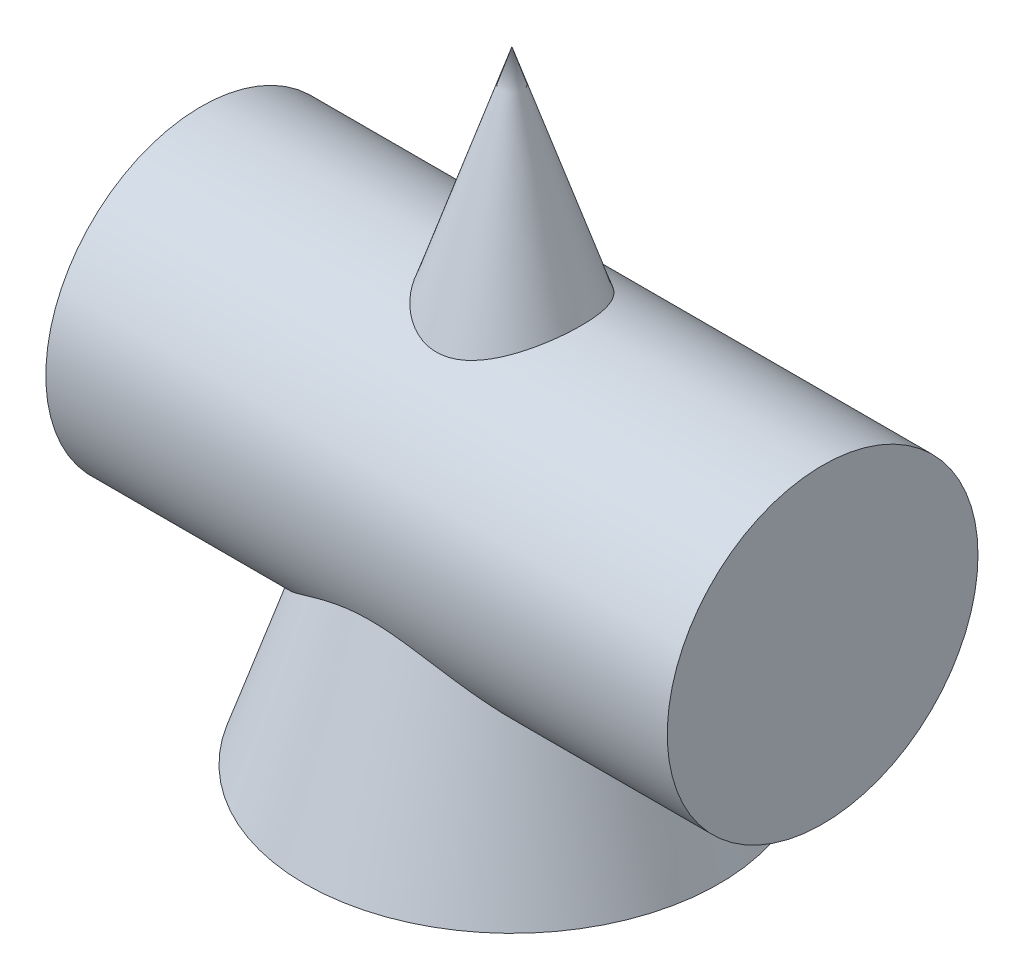
ISO-10303-21;
HEADER;
FILE_DESCRIPTION(('STEP AP214'),'2;1');
FILE_NAME('part.step','',(''),(''),'','','');
FILE_SCHEMA(('AUTOMOTIVE_DESIGN { 1 0 10303 214 1 1 1 1 }'));
ENDSEC;
DATA;
#1=APPLICATION_CONTEXT('core data for automotive mechanical design processes');
#2=APPLICATION_PROTOCOL_DEFINITION('international standard','automotive_design',2000,#1);
#3=PRODUCT_CONTEXT('',#1,'mechanical');
#4=PRODUCT('Part','Part','',(#3));
#5=PRODUCT_RELATED_PRODUCT_CATEGORY('part','',(#4));
#6=PRODUCT_DEFINITION_FORMATION('','',#4);
#7=PRODUCT_DEFINITION_CONTEXT('part definition',#1,'design');
#8=PRODUCT_DEFINITION('design','',#6,#7);
#9=PRODUCT_DEFINITION_SHAPE('','',#8);
#10=(LENGTH_UNIT() NAMED_UNIT(*) SI_UNIT(.MILLI.,.METRE.));
#11=(NAMED_UNIT(*) PLANE_ANGLE_UNIT() SI_UNIT($,.RADIAN.));
#12=(NAMED_UNIT(*) SI_UNIT($,.STERADIAN.) SOLID_ANGLE_UNIT());
#13=UNCERTAINTY_MEASURE_WITH_UNIT(LENGTH_MEASURE(1.E-05),#10,'distance_accuracy_value','');
#14=(GEOMETRIC_REPRESENTATION_CONTEXT(3) GLOBAL_UNCERTAINTY_ASSIGNED_CONTEXT((#13)) GLOBAL_UNIT_ASSIGNED_CONTEXT((#10,
#11,#12)) REPRESENTATION_CONTEXT('',''));
#15=CARTESIAN_POINT('',(0.,0.,0.));
#16=DIRECTION('',(0.,0.,1.));
#17=DIRECTION('',(1.,0.,0.));
#18=AXIS2_PLACEMENT_3D('',#15,#16,#17);
#19=CARTESIAN_POINT('',(0.,60.,0.));
#20=DIRECTION('',(0.,-1.,0.));
#21=DIRECTION('',(0.,0.,-1.));
#22=AXIS2_PLACEMENT_3D('',#19,#20,#21);
#23=CONICAL_SURFACE('',#22,0.,0.321750554396642);
#24=CARTESIAN_POINT('',(-12.6582579578055,13.1227978788821,-9.16144474273097));
#25=CARTESIAN_POINT('',(-12.906057989747,12.9392103508945,-8.92343623878181));
#26=CARTESIAN_POINT('',(-13.146427450124,12.7590327755955,-8.67505850013339));
#27=CARTESIAN_POINT('',(-13.6105617313405,12.4079211393712,-8.15704838342118));
#28=CARTESIAN_POINT('',(-13.8343263055411,12.2369872157556,-7.8874156897717));
#29=CARTESIAN_POINT('',(-14.2628249225345,11.9071926548073,-7.32693824073121));
#30=CARTESIAN_POINT('',(-14.4675770302104,11.7483205835194,-7.03611409950916));
#31=CARTESIAN_POINT('',(-14.8556332820439,11.4453841933494,-6.43320423704956));
#32=CARTESIAN_POINT('',(-15.0389432029007,11.3013158874899,-6.12112427831768));
#33=CARTESIAN_POINT('',(-15.3423748539452,11.0616862660614,-5.54946248089308));
#34=CARTESIAN_POINT('',(-15.4674073899374,10.9625267041328,-5.29398726370502));
#35=CARTESIAN_POINT('',(-15.701326674199,10.7764326866408,-4.7714776387355));
#36=CARTESIAN_POINT('',(-15.810217251202,10.6894953323285,-4.50444599151569));
#37=CARTESIAN_POINT('',(-16.0102844534952,10.5293658391605,-3.9599528509088));
#38=CARTESIAN_POINT('',(-16.1014695234882,10.4561671481605,-3.6824964054046));
#39=CARTESIAN_POINT('',(-16.2646978318328,10.324888770802,-3.11848196459449));
#40=CARTESIAN_POINT('',(-16.3367408573472,10.266809252551,-2.83192386812856));
#41=CARTESIAN_POINT('',(-16.4607976155978,10.1666667559896,-2.24947981645985));
#42=CARTESIAN_POINT('',(-16.5126615671709,10.124723576006,-1.95354110495455));
#43=CARTESIAN_POINT('',(-16.5945347579964,10.0584622807002,-1.35668461914164));
#44=CARTESIAN_POINT('',(-16.6245439719978,10.0341441857424,-1.05576683908154));
#45=CARTESIAN_POINT('',(-16.6620387469385,10.0037545456146,-0.451710402296231));
#46=CARTESIAN_POINT('',(-16.6695319923177,9.99767677523365,-0.148572538674889));
#47=CARTESIAN_POINT('',(-16.6618432204354,10.0039108775291,0.457209296700029));
#48=CARTESIAN_POINT('',(-16.6466631102281,10.0162212035843,0.759853307848173));
#49=CARTESIAN_POINT('',(-16.5969170451751,10.0565252294811,1.32835409018003));
#50=CARTESIAN_POINT('',(-16.5646963959106,10.082621185243,1.59455673866386));
#51=CARTESIAN_POINT('',(-16.4831886420775,10.1485545891208,2.12257982393228));
#52=CARTESIAN_POINT('',(-16.4339030778149,10.1883907970189,2.38440065399142));
#53=CARTESIAN_POINT('',(-16.3190505794183,10.2810688846683,2.90210939745635));
#54=CARTESIAN_POINT('',(-16.2534819079292,10.3339121522255,3.15799667458371));
#55=CARTESIAN_POINT('',(-16.1070307506626,10.4516915173876,3.66249062864728));
#56=CARTESIAN_POINT('',(-16.0261473208349,10.5166283604747,3.91109685566506));
#57=CARTESIAN_POINT('',(-15.8459549259472,10.6609232752184,4.41155982453926));
#58=CARTESIAN_POINT('',(-15.7459544402277,10.740818920295,4.663012316513));
#59=CARTESIAN_POINT('',(-15.531577116586,10.9115420883346,5.15591652931562));
#60=CARTESIAN_POINT('',(-15.4171947718714,11.0023737981321,5.39736437204395));
#61=CARTESIAN_POINT('',(-15.0543476020824,11.289423446152,6.10568046320458));
#62=CARTESIAN_POINT('',(-14.7861037593564,11.5002594522646,6.55673583181472));
#63=CARTESIAN_POINT('',(-14.2669711470614,11.9040271469909,7.32411453065443));
#64=CARTESIAN_POINT('',(-14.0241142422886,12.0915343461858,7.64892717385607));
#65=CARTESIAN_POINT('',(-13.5148494521351,12.4807758006592,8.27063904645106));
#66=CARTESIAN_POINT('',(-13.2484306056366,12.6825166685831,8.56752515035866));
#67=CARTESIAN_POINT('',(-12.6944170565624,13.0968457659793,9.13447239651994));
#68=CARTESIAN_POINT('',(-12.4067655544791,13.3094625868564,9.40445668593468));
#69=CARTESIAN_POINT('',(-11.8132644113633,13.7414328123205,9.917515212002));
#70=CARTESIAN_POINT('',(-11.5074160241738,13.9607857522575,10.1605912994504));
#71=CARTESIAN_POINT('',(-10.7881175989815,14.4668798215489,10.6874997226412));
#72=CARTESIAN_POINT('',(-10.3691557139454,14.7547410016023,10.962750666206));
#73=CARTESIAN_POINT('',(-9.50555747250108,15.3286507100886,11.4722379526691));
#74=CARTESIAN_POINT('',(-9.06090808796414,15.6146982355981,11.7064532359957));
#75=CARTESIAN_POINT('',(-8.14699718543699,16.1761604926316,12.1352575731256));
#76=CARTESIAN_POINT('',(-7.67775321596454,16.4515825683593,12.3298744095827));
#77=CARTESIAN_POINT('',(-6.71389213594302,16.9813321090065,12.6807570159306));
#78=CARTESIAN_POINT('',(-6.2192937115425,17.2356747576791,12.8370505523018));
#79=CARTESIAN_POINT('',(-5.4206414528937,17.6079117587134,13.0530358427346));
#80=CARTESIAN_POINT('',(-5.12550846183456,17.737659337015,13.1254631979));
#81=CARTESIAN_POINT('',(-4.52627243783114,17.9822751767869,13.2578597493728));
#82=CARTESIAN_POINT('',(-4.22216796877408,18.0971410400198,13.3178269386211));
#83=CARTESIAN_POINT('',(-3.60613281651345,18.3078580389296,13.4249468496154));
#84=CARTESIAN_POINT('',(-3.29422612767391,18.4037609300121,13.472134584198));
#85=CARTESIAN_POINT('',(-2.66276659649933,18.5728231266892,13.5536056871026));
#86=CARTESIAN_POINT('',(-2.34321830329909,18.6459956179808,13.5878965392303));
#87=CARTESIAN_POINT('',(-1.69288676830963,18.766735279078,13.6437148563713));
#88=CARTESIAN_POINT('',(-1.3620058574709,18.8138813335973,13.6650329504237));
#89=CARTESIAN_POINT('',(-0.696711996065167,18.8777140907748,13.6937531482358));
#90=CARTESIAN_POINT('',(-0.36229957664515,18.8944053100922,13.7011573155303));
#91=CARTESIAN_POINT('',(0.306611423739536,18.8961493295522,13.7019345536785));
#92=CARTESIAN_POINT('',(0.641109999875338,18.8812036275646,13.6953082888118));
#93=CARTESIAN_POINT('',(1.30675795927308,18.8207454191722,13.6681334307035));
#94=CARTESIAN_POINT('',(1.63790675995271,18.7752276854934,13.647582456579));
#95=CARTESIAN_POINT('',(2.32114326630478,18.6516780400069,13.5905768930105));
#96=CARTESIAN_POINT('',(2.67269633059409,18.5712674324538,13.5529470870427));
#97=CARTESIAN_POINT('',(3.36644437146525,18.3831819813255,13.4621155622893));
#98=CARTESIAN_POINT('',(3.70863473520912,18.2754939574165,13.4089063136386));
#99=CARTESIAN_POINT('',(4.21462699035522,18.0973770428219,13.3175927237764));
#100=CARTESIAN_POINT('',(4.3824142973554,18.0350947623167,13.2851593208287));
#101=CARTESIAN_POINT('',(4.71524330421865,17.9056878628057,13.2165086796606));
#102=CARTESIAN_POINT('',(4.88028613605158,17.8385653043813,13.1802930486842));
#103=CARTESIAN_POINT('',(5.37145799080057,17.630781762922,13.0659701093493));
#104=CARTESIAN_POINT('',(5.69359087944874,17.4837191006869,12.9821938917349));
#105=CARTESIAN_POINT('',(6.25706701437387,17.2108307064347,12.8198358857617));
#106=CARTESIAN_POINT('',(6.50050452128994,17.0875134395746,12.7442117603215));
#107=CARTESIAN_POINT('',(6.98113952116373,16.8348078754267,12.5838013498537));
#108=CARTESIAN_POINT('',(7.21833653746573,16.7054191164804,12.4990143674685));
#109=CARTESIAN_POINT('',(7.92097113893693,16.3102877075034,12.2307037996706));
#110=CARTESIAN_POINT('',(8.37731693021747,16.0376472429036,12.0332695482343));
#111=CARTESIAN_POINT('',(9.2657110102536,15.4839542378824,11.6003672427773));
#112=CARTESIAN_POINT('',(9.69777203224606,15.2029062265081,11.3649193760323));
#113=CARTESIAN_POINT('',(10.537069721018,14.6400700287229,10.8543153956016));
#114=CARTESIAN_POINT('',(10.9443175446501,14.3582822352883,10.5791773182024));
#115=CARTESIAN_POINT('',(11.6396606252234,13.8662250853033,10.0566397893176));
#116=CARTESIAN_POINT('',(11.9333218977218,13.6546638594231,9.8178381689611));
#117=CARTESIAN_POINT('',(12.5033597889067,13.2382560651429,9.31493085145073));
#118=CARTESIAN_POINT('',(12.779736120541,13.0334096082824,9.05082473424791));
#119=CARTESIAN_POINT('',(13.3125039394036,12.6341073742647,8.49711732638601));
#120=CARTESIAN_POINT('',(13.5689332282306,12.4396321740393,8.20756659016079));
#121=CARTESIAN_POINT('',(14.05967783531,12.0641198214284,7.60196653656662));
#122=CARTESIAN_POINT('',(14.2939916319187,11.8830835938863,7.28591539867404));
#123=CARTESIAN_POINT('',(14.6806958787688,11.5821833172286,6.71111421314451));
#124=CARTESIAN_POINT('',(14.8387779156205,11.4584612302612,6.4581999170933));
#125=CARTESIAN_POINT('',(15.138964060121,11.2224695433107,5.93810826950677));
#126=CARTESIAN_POINT('',(15.2810772573177,11.1101934316285,5.67093916093386));
#127=CARTESIAN_POINT('',(15.5476147882072,10.8988444793688,5.12285726720332));
#128=CARTESIAN_POINT('',(15.6720391630263,10.7997716080938,4.84194451400158));
#129=CARTESIAN_POINT('',(15.9013084696949,10.6166837025012,4.26744476236742));
#130=CARTESIAN_POINT('',(16.0061531026917,10.532668898021,3.97385757056461));
#131=CARTESIAN_POINT('',(16.195332581489,10.3807392434881,3.37258260763743));
#132=CARTESIAN_POINT('',(16.2794489886354,10.3129960409919,3.06478215502828));
#133=CARTESIAN_POINT('',(16.4240077756044,10.1963959084782,2.44012809040907));
#134=CARTESIAN_POINT('',(16.484450085679,10.1475390341031,2.12327445172973));
#135=CARTESIAN_POINT('',(16.5801938605407,10.0700791593399,1.48362643842402));
#136=CARTESIAN_POINT('',(16.61551831798,10.0414576358345,1.16083777510914));
#137=CARTESIAN_POINT('',(16.6602127702793,10.0052359963519,0.512314236217841));
#138=CARTESIAN_POINT('',(16.6695869825198,9.99763246457425,0.186579848008426));
#139=CARTESIAN_POINT('',(16.6627215798523,10.003198466719,-0.415156645306657));
#140=CARTESIAN_POINT('',(16.6501371167188,10.0134036583632,-0.691238681212603));
#141=CARTESIAN_POINT('',(16.6063539602977,10.0488814843193,-1.24091791906702));
#142=CARTESIAN_POINT('',(16.575157542448,10.074152276759,-1.51451542061626));
#143=CARTESIAN_POINT('',(16.494713922357,10.1392365878076,-2.05729043830041));
#144=CARTESIAN_POINT('',(16.4454653996498,10.1790511702574,-2.32646762959553));
#145=CARTESIAN_POINT('',(16.329756127104,10.2724381690457,-2.85865703002502));
#146=CARTESIAN_POINT('',(16.2632945695417,10.3260112310014,-3.12166894922151));
#147=CARTESIAN_POINT('',(16.1149423960322,10.4453370423023,-3.63746746249671));
#148=CARTESIAN_POINT('',(16.0332124379822,10.5109628579541,-3.89032992594196));
#149=CARTESIAN_POINT('',(15.8549855734351,10.6536990639128,-4.38754890488524));
#150=CARTESIAN_POINT('',(15.7584831355762,10.7308137557887,-4.63190219198995));
#151=CARTESIAN_POINT('',(15.5518976658656,10.8953830655156,-5.11116165762117));
#152=CARTESIAN_POINT('',(15.441815441134,10.9828370688326,-5.34606839650767));
#153=CARTESIAN_POINT('',(15.2091967589587,11.1669678958161,-5.80591064337493));
#154=CARTESIAN_POINT('',(15.0866575764958,11.2636467371749,-6.03084395409835));
#155=CARTESIAN_POINT('',(14.7638455457918,11.5172646149015,-6.58410073688096));
#156=CARTESIAN_POINT('',(14.5561568362787,11.6795015212642,-6.90570443389251));
#157=CARTESIAN_POINT('',(14.1180257882716,12.0190289276435,-7.52456581800447));
#158=CARTESIAN_POINT('',(13.8875740181387,12.1963256632473,-7.82181331925172));
#159=CARTESIAN_POINT('',(13.4062973228895,12.5630187704929,-8.39266499794654));
#160=CARTESIAN_POINT('',(13.155426913798,12.7524419427212,-8.66621342424628));
#161=CARTESIAN_POINT('',(12.6361580464136,13.1399180104388,-9.1893652942545));
#162=CARTESIAN_POINT('',(12.3677600138405,13.3379706962912,-9.43896931917348));
#163=CARTESIAN_POINT('',(11.7166520561835,13.8115797715591,-9.99989068716091));
#164=CARTESIAN_POINT('',(11.3273122831036,14.0895861494842,-10.3014694504582));
#165=CARTESIAN_POINT('',(10.5226930491655,14.6494786281384,-10.8638945555957));
#166=CARTESIAN_POINT('',(10.1074012227826,14.9313665276721,-11.1247212696853));
#167=CARTESIAN_POINT('',(9.25239217262771,15.4919248695409,-11.6074691275789));
#168=CARTESIAN_POINT('',(8.81266191523285,15.7705934973898,-11.8293692435071));
#169=CARTESIAN_POINT('',(7.90941810245221,16.3162540661101,-12.2355215725433));
#170=CARTESIAN_POINT('',(7.44591564254796,16.5832513486167,-12.419791152887));
#171=CARTESIAN_POINT('',(6.65363455009484,17.0094454072668,-12.6961541772567));
#172=CARTESIAN_POINT('',(6.3316997312628,17.1748078596304,-12.7984541328528));
#173=CARTESIAN_POINT('',(5.67651026021464,17.4918673432962,-12.9869904179628));
#174=CARTESIAN_POINT('',(5.34325572833497,17.6435645198073,-13.0732269181794));
#175=CARTESIAN_POINT('',(4.66612326756118,17.9282087596279,-13.2293637109786));
#176=CARTESIAN_POINT('',(4.32227578731478,18.0612043822328,-13.2993066329856));
#177=CARTESIAN_POINT('',(3.62340409396534,18.3033783504898,-13.42288257228));
#178=CARTESIAN_POINT('',(3.26838361519242,18.4125645591787,-13.4765209764317));
#179=CARTESIAN_POINT('',(2.6311978121792,18.5794656598932,-13.556667746134));
#180=CARTESIAN_POINT('',(2.3510504137421,18.6432429215731,-13.5865783865324));
#181=CARTESIAN_POINT('',(1.78599764761856,18.7505425026061,-13.6362677924028));
#182=CARTESIAN_POINT('',(1.50109299826583,18.794067851807,-13.6560480735021));
#183=CARTESIAN_POINT('',(0.928645571577991,18.8587549307656,-13.6852616008126));
#184=CARTESIAN_POINT('',(0.641107570689667,18.8799512376481,-13.6947108457738));
#185=CARTESIAN_POINT('',(0.0650920718821256,18.8989966022396,-13.7032066681516));
#186=CARTESIAN_POINT('',(-0.22338542906786,18.8968455845569,-13.7022532119763));
#187=CARTESIAN_POINT('',(-0.798776718032784,18.8693213627146,-13.6899597116309));
#188=CARTESIAN_POINT('',(-1.08569150300857,18.8439652988891,-13.6786273338138));
#189=CARTESIAN_POINT('',(-1.65611254243767,18.7713567174361,-13.6457162319276));
#190=CARTESIAN_POINT('',(-1.93961867464591,18.7241034168934,-13.6241371414962));
#191=CARTESIAN_POINT('',(-2.50224206023308,18.6097552849362,-13.5708782940329));
#192=CARTESIAN_POINT('',(-2.78134819581411,18.5426167172856,-13.5391762601724));
#193=CARTESIAN_POINT('',(-3.33359722430738,18.391160376456,-13.4658939854478));
#194=CARTESIAN_POINT('',(-3.60673797624275,18.3068365441212,-13.4243102596501));
#195=CARTESIAN_POINT('',(-4.0938694140851,18.1415877605598,-13.3405024439177));
#196=CARTESIAN_POINT('',(-4.30902457821587,18.0631962278293,-13.2999786063372));
#197=CARTESIAN_POINT('',(-4.73490342477624,17.8984252618429,-13.2127339821388));
#198=CARTESIAN_POINT('',(-4.9456279754424,17.8120474118588,-13.1660144230163));
#199=CARTESIAN_POINT('',(-5.57148701524816,17.5426904012848,-13.0165509557277));
#200=CARTESIAN_POINT('',(-5.9800907640726,17.3495636271091,-12.9045395256445));
#201=CARTESIAN_POINT('',(-6.78095496725751,16.9444931196989,-12.6556511440483));
#202=CARTESIAN_POINT('',(-7.17317989449381,16.7325113171624,-12.5187232743686));
#203=CARTESIAN_POINT('',(-7.94102290120518,16.2967729324871,-12.2198055224259));
#204=CARTESIAN_POINT('',(-8.31664505883727,16.0730192717927,-12.0578218391324));
#205=CARTESIAN_POINT('',(-9.04919866429574,15.6205532514957,-11.7092712953535));
#206=CARTESIAN_POINT('',(-9.40623735690087,15.3918835091619,-11.5228742230891));
#207=CARTESIAN_POINT('',(-10.1040489795924,14.9325444134568,-11.1238002225023));
#208=CARTESIAN_POINT('',(-10.4448205773991,14.7018748981254,-10.9111211467779));
#209=CARTESIAN_POINT('',(-11.1087677552216,14.2427966802954,-10.4587910000066));
#210=CARTESIAN_POINT('',(-11.4319654321329,14.0143854486828,-10.2191750193182));
#211=CARTESIAN_POINT('',(-12.0596804064346,13.563315494656,-9.71171821263467));
#212=CARTESIAN_POINT('',(-12.3642009978082,13.3406557619119,-9.44388238640865));
#213=CARTESIAN_POINT('',(-12.6582579578055,13.1227978788821,-9.16144474273097));
#214=B_SPLINE_CURVE_WITH_KNOTS('',3,(#24,#25,#26,#27,#28,#29,#30,#31,#32,#33,#34,#35,#36,#37,
#38,#39,#40,#41,#42,#43,#44,#45,#46,#47,#48,#49,#50,#51,#52,#53,#54,#55,#56,#57,#58,#59,#60,#61,
#62,#63,#64,#65,#66,#67,#68,#69,#70,#71,#72,#73,#74,#75,#76,#77,#78,#79,#80,#81,#82,#83,#84,#85,
#86,#87,#88,#89,#90,#91,#92,#93,#94,#95,#96,#97,#98,#99,#100,#101,#102,#103,#104,#105,#106,#107,
#108,#109,#110,#111,#112,#113,#114,#115,#116,#117,#118,#119,#120,#121,#122,#123,#124,#125,#126,
#127,#128,#129,#130,#131,#132,#133,#134,#135,#136,#137,#138,#139,#140,#141,#142,#143,#144,#145,
#146,#147,#148,#149,#150,#151,#152,#153,#154,#155,#156,#157,#158,#159,#160,#161,#162,#163,#164,
#165,#166,#167,#168,#169,#170,#171,#172,#173,#174,#175,#176,#177,#178,#179,#180,#181,#182,#183,
#184,#185,#186,#187,#188,#189,#190,#191,#192,#193,#194,#195,#196,#197,#198,#199,#200,#201,#202,
#203,#204,#205,#206,#207,#208,#209,#210,#211,#212,#213),.UNSPECIFIED.,.T.,.F.,(4,2,2,2,2,2,2,2,
2,2,2,2,2,2,2,2,2,2,2,2,2,2,2,2,2,2,2,2,2,2,2,2,2,2,2,2,2,2,2,2,2,2,2,2,2,2,2,2,2,2,2,2,2,2,2,2,
2,2,2,2,2,2,2,2,2,2,2,2,2,2,2,2,2,2,2,2,2,2,2,2,2,2,2,2,2,2,2,2,2,2,2,2,2,2,4),(0.,
1.16842171326875,2.33686077809898,3.50417802871152,4.67118006671549,5.57402638611544,
6.47665821431812,7.37885846590882,8.28106874848869,9.18985353136625,10.0986393642638,
11.0071150038164,11.9155142358569,12.7228240133897,13.5300609408667,14.337384034952,
15.1447569112024,15.9903899522011,16.8363477765332,18.5275579267805,19.8663434875852,
21.2057551666816,22.5488897042618,23.8919318010918,25.6238928079107,27.3567400729977,
29.0883673311875,30.8187362369488,31.80946403588,32.8003512957915,33.7884956330216,
34.776065681694,35.7791786397898,36.7821428173166,37.7850595099427,38.7881477271679,
39.8742347899896,40.9608476499877,41.5064111757812,42.051743802471,43.1425364656626,
43.9917876227607,44.8411034594,46.5402018782745,48.2384009345377,49.935830700899,
51.235672189606,52.5355352591294,53.8328717024513,55.1302973432814,56.0981784634175,
57.0655058394825,58.0328309664827,59.0001708569118,59.977306296602,60.9544446150799,
61.9306873145612,62.906771347768,63.7354150526709,64.5639574710056,65.3925605072248,
66.2212024327889,67.0415717278443,67.8622489542296,68.6828774268184,69.5036858036976,
70.7491714025704,71.9951752376885,73.2440348702501,74.4928641811484,76.187079842913,
77.8821090050935,79.5780510093011,81.273208524991,82.4008767397075,83.5285329702719,
84.6532048836237,85.7775048107205,86.643290002482,87.5089456241828,88.3732587754101,
89.2375747176248,90.101252750433,90.9649616656252,91.8305845354983,92.696513135079,
93.3938858828901,94.0911206731428,95.4862838917529,96.8843308956751,98.2820325653885,
99.6704841301252,101.059049215032,102.445825948913,103.832357396496),.UNSPECIFIED.);
#215=CARTESIAN_POINT('',(-12.6582579578055,13.1227978788821,-9.16144474273097));
#216=VERTEX_POINT('',#215);
#217=EDGE_CURVE('E12',#216,#216,#214,.T.);
#218=ORIENTED_EDGE('',*,*,#217,.F.);
#219=EDGE_LOOP('',(#218));
#220=FACE_BOUND('',#219,.T.);
#221=CARTESIAN_POINT('',(0.,0.,0.));
#222=DIRECTION('',(0.,1.,0.));
#223=DIRECTION('',(0.,0.,1.));
#224=AXIS2_PLACEMENT_3D('',#221,#222,#223);
#225=CIRCLE('',#224,20.);
#226=CARTESIAN_POINT('',(0.,0.,20.));
#227=VERTEX_POINT('',#226);
#228=EDGE_CURVE('E80',#227,#227,#225,.T.);
#229=ORIENTED_EDGE('',*,*,#228,.T.);
#230=EDGE_LOOP('',(#229));
#231=FACE_BOUND('',#230,.T.);
#232=ADVANCED_FACE('F42',(#220,#231),#23,.T.);
#233=CARTESIAN_POINT('',(0.,0.,0.));
#234=DIRECTION('',(0.,1.,0.));
#235=DIRECTION('',(0.,0.,1.));
#236=AXIS2_PLACEMENT_3D('',#233,#234,#235);
#237=PLANE('',#236);
#238=ORIENTED_EDGE('',*,*,#228,.F.);
#239=EDGE_LOOP('',(#238));
#240=FACE_BOUND('',#239,.T.);
#241=ADVANCED_FACE('F69',(#240),#237,.F.);
#242=CARTESIAN_POINT('',(-30.,25.,0.));
#243=DIRECTION('',(1.,0.,0.));
#244=DIRECTION('',(0.,0.,-1.));
#245=AXIS2_PLACEMENT_3D('',#242,#243,#244);
#246=CYLINDRICAL_SURFACE('',#245,15.);
#247=ORIENTED_EDGE('',*,*,#217,.T.);
#248=EDGE_LOOP('',(#247));
#249=FACE_BOUND('',#248,.T.);
#250=CARTESIAN_POINT('',(-0.620761379108218,38.1227236383891,-7.2659565310056));
#251=CARTESIAN_POINT('',(-0.469474290770735,38.113940361321,-7.28181987506649));
#252=CARTESIAN_POINT('',(-0.317393534991869,38.108319084713,-7.29191290108205));
#253=CARTESIAN_POINT('',(-0.012801568727285,38.1036075738387,-7.30037618786055));
#254=CARTESIAN_POINT('',(0.139709648137429,38.1045174368707,-7.29874627397996));
#255=CARTESIAN_POINT('',(0.443996704917348,38.1128351850509,-7.28379196521212));
#256=CARTESIAN_POINT('',(0.595772444895312,38.1202439296825,-7.27046602351392));
#257=CARTESIAN_POINT('',(0.897489967412345,38.1412941546527,-7.23234809851419));
#258=CARTESIAN_POINT('',(1.04743101124959,38.1549380658221,-7.20755164329278));
#259=CARTESIAN_POINT('',(1.34370876206906,38.1879105877272,-7.14704082304571));
#260=CARTESIAN_POINT('',(1.49005908757058,38.2072122045732,-7.11137827085624));
#261=CARTESIAN_POINT('',(1.77906021640173,38.2509076147286,-7.02962224638203));
#262=CARTESIAN_POINT('',(1.92170955068664,38.2753033963378,-6.98352470063039));
#263=CARTESIAN_POINT('',(2.34301750255905,38.3550864977492,-6.83044186507646));
#264=CARTESIAN_POINT('',(2.61517129107126,38.4170856907999,-6.70863803300603));
#265=CARTESIAN_POINT('',(3.16226668086151,38.5589090446361,-6.41751529493526));
#266=CARTESIAN_POINT('',(3.43508524278327,38.639858404774,-6.2448162760446));
#267=CARTESIAN_POINT('',(3.95237479795275,38.8080536962304,-5.86353296249986));
#268=CARTESIAN_POINT('',(4.19683050597251,38.8953029819761,-5.65492946730823));
#269=CARTESIAN_POINT('',(4.5635261695509,39.0346536718216,-5.29617221330043));
#270=CARTESIAN_POINT('',(4.69559751837911,39.0868817636831,-5.15592927228568));
#271=CARTESIAN_POINT('',(4.94830429321049,39.1899685186985,-4.86503565731464));
#272=CARTESIAN_POINT('',(5.06894205144972,39.2408274596113,-4.71438711678928));
#273=CARTESIAN_POINT('',(5.29842658732031,39.3400460006983,-4.40337973523634));
#274=CARTESIAN_POINT('',(5.40726304588204,39.388403394505,-4.24301258420382));
#275=CARTESIAN_POINT('',(5.61249880663212,39.4814762612127,-3.91358282496264));
#276=CARTESIAN_POINT('',(5.70890246924214,39.5261930089188,-3.74452329459447));
#277=CARTESIAN_POINT('',(5.89625054133037,39.6145292101853,-3.38418799736173));
#278=CARTESIAN_POINT('',(5.98607951947123,39.6577502537574,-3.19223244142503));
#279=CARTESIAN_POINT('',(6.14989076734196,39.7376420697152,-2.80033880546614));
#280=CARTESIAN_POINT('',(6.22387203504224,39.7743124278854,-2.60040022163543));
#281=CARTESIAN_POINT('',(6.35528442095118,39.8401002212041,-2.19403024589491));
#282=CARTESIAN_POINT('',(6.4127223409248,39.8692207599529,-1.98760156120864));
#283=CARTESIAN_POINT('',(6.51049066693715,39.9191203600648,-1.56974763718227));
#284=CARTESIAN_POINT('',(6.55082235682942,39.9399000474178,-1.35832277407221));
#285=CARTESIAN_POINT('',(6.61228820952216,39.9716850081844,-0.943242207549794));
#286=CARTESIAN_POINT('',(6.6343093009612,39.9831412028651,-0.739752040024914));
#287=CARTESIAN_POINT('',(6.66232681346203,39.9977308163498,-0.331374921575855));
#288=CARTESIAN_POINT('',(6.66832373123435,40.0008644931317,-0.126488014144604));
#289=CARTESIAN_POINT('',(6.66422663194742,39.9987270090669,0.283043760283624));
#290=CARTESIAN_POINT('',(6.65413538040808,39.9934572927446,0.487688662829455));
#291=CARTESIAN_POINT('',(6.61797954802481,39.9746538878948,0.895175128339181));
#292=CARTESIAN_POINT('',(6.59191524513132,39.961120343168,1.09801672262052));
#293=CARTESIAN_POINT('',(6.52560886945703,39.9269222391866,1.49138293946803));
#294=CARTESIAN_POINT('',(6.4860506196842,39.9066024659166,1.68205353757003));
#295=CARTESIAN_POINT('',(6.3929587955388,39.8592051227798,2.05916265476874));
#296=CARTESIAN_POINT('',(6.33942025899799,39.8321251535971,2.2455996455964));
#297=CARTESIAN_POINT('',(6.21884201765039,39.7718337094521,2.61296183434351));
#298=CARTESIAN_POINT('',(6.15180654618754,39.7386241573186,2.79388874007926));
#299=CARTESIAN_POINT('',(6.00469649716539,39.6667883499067,3.14931875148633));
#300=CARTESIAN_POINT('',(5.92461720511604,39.6281601368392,3.32381950645923));
#301=CARTESIAN_POINT('',(5.74834585606792,39.5446216242595,3.67252653124733));
#302=CARTESIAN_POINT('',(5.65162095459729,39.4995164699173,3.84641678228747));
#303=CARTESIAN_POINT('',(5.44512065341516,39.4053667044287,4.18525357251166));
#304=CARTESIAN_POINT('',(5.33533924237163,39.3563202820846,4.35019594072553));
#305=CARTESIAN_POINT('',(5.10319238534234,39.2554045051526,4.67029211264128));
#306=CARTESIAN_POINT('',(4.98081599910343,39.2035327151183,4.82543721427042));
#307=CARTESIAN_POINT('',(4.72405259622433,39.0982518816545,5.12488884259651));
#308=CARTESIAN_POINT('',(4.58966556831275,39.0448428367824,5.26919535912174));
#309=CARTESIAN_POINT('',(4.30092745799125,38.9346310908187,5.55434921960284));
#310=CARTESIAN_POINT('',(4.14586266515175,38.8778167773567,5.69447134115362));
#311=CARTESIAN_POINT('',(3.82325860499959,38.7657343813025,5.96031648802435));
#312=CARTESIAN_POINT('',(3.6557174723219,38.7104665316318,6.08603735301964));
#313=CARTESIAN_POINT('',(3.30906137518056,38.6035023049665,6.32150496688648));
#314=CARTESIAN_POINT('',(3.12996446861126,38.5518006048942,6.43127580733691));
#315=CARTESIAN_POINT('',(2.76081865774862,38.4539783908015,6.63348216325687));
#316=CARTESIAN_POINT('',(2.57077455057865,38.4078554591897,6.72592519744741));
#317=CARTESIAN_POINT('',(2.23535440506796,38.3351552162627,6.86863447161562));
#318=CARTESIAN_POINT('',(2.09231297872097,38.3067153133754,6.9234715994235));
#319=CARTESIAN_POINT('',(1.80178116183714,38.2546642968724,7.02260717579671));
#320=CARTESIAN_POINT('',(1.65429188137956,38.2310519896622,7.06690822978752));
#321=CARTESIAN_POINT('',(1.35575094017322,38.1894094360704,7.14432739717096));
#322=CARTESIAN_POINT('',(1.20470220873245,38.1713747610351,7.17745438470471));
#323=CARTESIAN_POINT('',(0.899964347514311,38.1414877710621,7.23203087247538));
#324=CARTESIAN_POINT('',(0.746276421990616,38.1296327099567,7.2534855599685));
#325=CARTESIAN_POINT('',(0.436646647269028,38.1124923268043,7.28442603668127));
#326=CARTESIAN_POINT('',(0.280697876392459,38.1072359922382,7.29385901859947));
#327=CARTESIAN_POINT('',(-0.031540323458121,38.103590943278,7.30040531251004));
#328=CARTESIAN_POINT('',(-0.187829758062506,38.105202343265,7.29751841931671));
#329=CARTESIAN_POINT('',(-0.499498186528537,38.1152341173146,7.2794741311829));
#330=CARTESIAN_POINT('',(-0.654877086353285,38.1236551825946,7.26431549059444));
#331=CARTESIAN_POINT('',(-0.963521340414524,38.146977710391,7.22201763427925));
#332=CARTESIAN_POINT('',(-1.11678586477168,38.1618816467015,7.19487384508877));
#333=CARTESIAN_POINT('',(-1.55464802883592,38.2135443724044,7.09981484265229));
#334=CARTESIAN_POINT('',(-1.83526499229593,38.2579660637023,7.01708547022424));
#335=CARTESIAN_POINT('',(-2.37932890640366,38.3631073353792,6.81470584541701));
#336=CARTESIAN_POINT('',(-2.64276971159113,38.4238327097153,6.69504246526775));
#337=CARTESIAN_POINT('',(-3.18257008448581,38.5646690341593,6.40538335227354));
#338=CARTESIAN_POINT('',(-3.45608926124118,38.6462781166727,6.23084362769247));
#339=CARTESIAN_POINT('',(-3.97440652051118,38.8156631563965,5.84565344073152));
#340=CARTESIAN_POINT('',(-4.21918485540592,38.903443288245,5.63497839180004));
#341=CARTESIAN_POINT('',(-4.58570785706593,39.0433241780868,5.27316269953955));
#342=CARTESIAN_POINT('',(-4.71742960846961,39.0956177933704,5.13202374888079));
#343=CARTESIAN_POINT('',(-4.96936234055371,39.1987604422519,4.83934327236828));
#344=CARTESIAN_POINT('',(-5.08957569554645,39.2496097722932,4.6878039033631));
#345=CARTESIAN_POINT('',(-5.31812864147577,39.3487299484685,4.37503038575595));
#346=CARTESIAN_POINT('',(-5.42645841011351,39.3969986449563,4.21378838543198));
#347=CARTESIAN_POINT('',(-5.63059859404299,39.4898160760626,3.88262657911876));
#348=CARTESIAN_POINT('',(-5.72641343266929,39.5343661229974,3.71270986885358));
#349=CARTESIAN_POINT('',(-5.91224606088286,39.6221796263138,3.35100349069035));
#350=CARTESIAN_POINT('',(-6.00117216808967,39.665049175992,3.15855522135579));
#351=CARTESIAN_POINT('',(-6.16313835169716,39.7441767227243,2.76575334911945));
#352=CARTESIAN_POINT('',(-6.23617744373377,39.7804343100767,2.56539925727874));
#353=CARTESIAN_POINT('',(-6.36566970327024,39.8453451550057,2.15828480807998));
#354=CARTESIAN_POINT('',(-6.4221296757875,39.8740015320848,1.95152711775588));
#355=CARTESIAN_POINT('',(-6.5179122329146,39.9229328262768,1.53311100482359));
#356=CARTESIAN_POINT('',(-6.55723610992168,39.9432083754624,1.32145295306707));
#357=CARTESIAN_POINT('',(-6.61668696071572,39.9739690717318,0.906241052463244));
#358=CARTESIAN_POINT('',(-6.63771921857977,39.9849152963146,0.70285061888804));
#359=CARTESIAN_POINT('',(-6.6637860970041,39.998492616668,0.294771516051009));
#360=CARTESIAN_POINT('',(-6.66882122828067,40.0011239778948,0.0900828884437331));
#361=CARTESIAN_POINT('',(-6.66283861104987,39.9980029330218,-0.318959674446026));
#362=CARTESIAN_POINT('',(-6.65182350988051,39.9922519095191,-0.523313659359288));
#363=CARTESIAN_POINT('',(-6.61386754708155,39.9725190080607,-0.930131852877705));
#364=CARTESIAN_POINT('',(-6.5869269413195,39.958537262344,-1.13259609179143));
#365=CARTESIAN_POINT('',(-6.518923889791,39.9234860674159,-1.52536508862386));
#366=CARTESIAN_POINT('',(-6.4785268205842,39.9027514397687,-1.71581563848408));
#367=CARTESIAN_POINT('',(-6.38378146578997,39.854556771183,-2.09241335195468));
#368=CARTESIAN_POINT('',(-6.32942822404144,39.8270943412048,-2.27855896112903));
#369=CARTESIAN_POINT('',(-6.20724923476612,39.7660783786996,-2.64527373211415));
#370=CARTESIAN_POINT('',(-6.13942772228898,39.7325267611807,-2.82584462630285));
#371=CARTESIAN_POINT('',(-5.99077559706507,39.660053467818,-3.18050430543105));
#372=CARTESIAN_POINT('',(-5.90994028248758,39.6211298518225,-3.35459071945766));
#373=CARTESIAN_POINT('',(-5.73206360284611,39.5369977641465,-3.70257939427016));
#374=CARTESIAN_POINT('',(-5.63447684741294,39.4915916505718,-3.8761551204304));
#375=CARTESIAN_POINT('',(-5.42625779362334,39.3968954081007,-4.21429081732055));
#376=CARTESIAN_POINT('',(-5.31561947216184,39.3476034894711,-4.37884657375683));
#377=CARTESIAN_POINT('',(-5.08175758818315,39.2462591745196,-4.69810324302278));
#378=CARTESIAN_POINT('',(-4.95852255888781,39.1942042841601,-4.85279496488203));
#379=CARTESIAN_POINT('',(-4.70004459607616,39.0886321700872,-5.15126231715992));
#380=CARTESIAN_POINT('',(-4.56480167915537,39.0351149483948,-5.29503796266464));
#381=CARTESIAN_POINT('',(-4.27441627827722,38.924812144572,-5.57890119735705));
#382=CARTESIAN_POINT('',(-4.11857007035598,38.8680203570292,-5.71826844387627));
#383=CARTESIAN_POINT('',(-3.79442606256343,38.7560907031772,-5.98252162083292));
#384=CARTESIAN_POINT('',(-3.62612629968983,38.7009530995433,-6.10740526028047));
#385=CARTESIAN_POINT('',(-3.27801971586434,38.5943790959713,-6.34108221458835));
#386=CARTESIAN_POINT('',(-3.09823308524947,38.5429365220565,-6.44990270613816));
#387=CARTESIAN_POINT('',(-2.72776611575514,38.4457612840256,-6.6501045734834));
#388=CARTESIAN_POINT('',(-2.53709097131292,38.4000259298689,-6.7414941759686));
#389=CARTESIAN_POINT('',(-2.20574551466197,38.3291914541642,-6.88016953788149));
#390=CARTESIAN_POINT('',(-2.06756486295515,38.3020532050589,-6.9324048230093));
#391=CARTESIAN_POINT('',(-1.78709912751271,38.2522964652608,-7.02705482231936));
#392=CARTESIAN_POINT('',(-1.6448150382853,38.2296768897844,-7.06947189391827));
#393=CARTESIAN_POINT('',(-1.35693624630857,38.1896294748255,-7.1439109267926));
#394=CARTESIAN_POINT('',(-1.21134394963192,38.1721979843965,-7.17594019957511));
#395=CARTESIAN_POINT('',(-0.917676947633159,38.1430668852361,-7.22915733040846));
#396=CARTESIAN_POINT('',(-0.769603273017773,38.1313649547627,-7.25034958001124));
#397=CARTESIAN_POINT('',(-0.620761379108218,38.1227236383891,-7.2659565310056));
#398=B_SPLINE_CURVE_WITH_KNOTS('',3,(#250,#251,#252,#253,#254,#255,#256,#257,#258,#259,#260,
#261,#262,#263,#264,#265,#266,#267,#268,#269,#270,#271,#272,#273,#274,#275,#276,#277,#278,#279,
#280,#281,#282,#283,#284,#285,#286,#287,#288,#289,#290,#291,#292,#293,#294,#295,#296,#297,#298,
#299,#300,#301,#302,#303,#304,#305,#306,#307,#308,#309,#310,#311,#312,#313,#314,#315,#316,#317,
#318,#319,#320,#321,#322,#323,#324,#325,#326,#327,#328,#329,#330,#331,#332,#333,#334,#335,#336,
#337,#338,#339,#340,#341,#342,#343,#344,#345,#346,#347,#348,#349,#350,#351,#352,#353,#354,#355,
#356,#357,#358,#359,#360,#361,#362,#363,#364,#365,#366,#367,#368,#369,#370,#371,#372,#373,#374,
#375,#376,#377,#378,#379,#380,#381,#382,#383,#384,#385,#386,#387,#388,#389,#390,#391,#392,#393,
#394,#395,#396,#397),.UNSPECIFIED.,.T.,.F.,(4,2,2,2,2,2,2,2,2,2,2,2,2,2,2,2,2,2,2,2,2,2,2,2,2,2,
2,2,2,2,2,2,2,2,2,2,2,2,2,2,2,2,2,2,2,2,2,2,2,2,2,2,2,2,2,2,2,2,2,2,2,2,2,2,2,2,2,2,2,2,2,2,2,
4),(0.,0.456969048478624,0.913944904707743,1.37098120554271,1.82819583792944,2.28326357450548,
2.73850926134471,3.64858792945319,4.64384334992471,5.63963266347004,6.23789582632815,
6.83603669098721,7.43469642326993,8.0331456197068,8.68121556867585,9.32932648215609,
9.97717054447572,10.6249659763182,11.2391747042393,11.8533643929582,12.4674485152421,
13.0815219520212,13.6682207970771,14.2551281689705,14.8418517420199,15.428787849839,
16.0402110940499,16.6519169406765,17.2641586851717,17.876401004232,18.5253238599498,
19.1743439331054,19.822373275219,20.4701207762151,20.9371068407558,21.4039773057431,
21.8704761170408,22.3367674431267,22.8051000486211,23.2734404541564,23.7418284047086,
24.210395244083,25.0942117650487,25.9783427909465,26.9784814035956,27.979303231878,
28.5788116889101,29.1781961928073,29.7780724393226,30.3777360857488,31.0257888469084,
31.6738817501746,32.3217082660706,32.9694859146988,33.5830042147926,34.1965029278102,
34.8099004613195,35.4232881399288,36.0099897979148,36.5969000961474,37.1836261339283,
37.7705646310034,38.3826145389701,38.9949480121029,39.6078439418874,40.2207390246306,
40.8698620598623,41.519087632526,42.1672018934639,42.815009509088,43.2652008409722,
43.7152839666138,44.1650496078637,44.6146328431618),.UNSPECIFIED.);
#399=CARTESIAN_POINT('',(-0.620761379108218,38.1227236383891,-7.2659565310056));
#400=VERTEX_POINT('',#399);
#401=EDGE_CURVE('E55',#400,#400,#398,.T.);
#402=ORIENTED_EDGE('',*,*,#401,.T.);
#403=EDGE_LOOP('',(#402));
#404=FACE_BOUND('',#403,.T.);
#405=CARTESIAN_POINT('',(-30.,25.,0.));
#406=DIRECTION('',(1.,0.,0.));
#407=DIRECTION('',(0.,0.,-1.));
#408=AXIS2_PLACEMENT_3D('',#405,#406,#407);
#409=CIRCLE('',#408,15.);
#410=CARTESIAN_POINT('',(-30.,25.,-15.));
#411=VERTEX_POINT('',#410);
#412=EDGE_CURVE('E84',#411,#411,#409,.T.);
#413=ORIENTED_EDGE('',*,*,#412,.T.);
#414=EDGE_LOOP('',(#413));
#415=FACE_BOUND('',#414,.T.);
#416=CARTESIAN_POINT('',(30.,25.,0.));
#417=DIRECTION('',(1.,0.,0.));
#418=DIRECTION('',(0.,0.,-1.));
#419=AXIS2_PLACEMENT_3D('',#416,#417,#418);
#420=CIRCLE('',#419,15.);
#421=CARTESIAN_POINT('',(30.,25.,-15.));
#422=VERTEX_POINT('',#421);
#423=EDGE_CURVE('E124',#422,#422,#420,.T.);
#424=ORIENTED_EDGE('',*,*,#423,.F.);
#425=EDGE_LOOP('',(#424));
#426=FACE_BOUND('',#425,.T.);
#427=ADVANCED_FACE('F74',(#249,#404,#415,#426),#246,.T.);
#428=CARTESIAN_POINT('',(-30.,25.,0.));
#429=DIRECTION('',(1.,0.,0.));
#430=DIRECTION('',(0.,0.,-1.));
#431=AXIS2_PLACEMENT_3D('',#428,#429,#430);
#432=PLANE('',#431);
#433=ORIENTED_EDGE('',*,*,#412,.F.);
#434=EDGE_LOOP('',(#433));
#435=FACE_BOUND('',#434,.T.);
#436=ADVANCED_FACE('F64',(#435),#432,.F.);
#437=CARTESIAN_POINT('',(30.,25.,0.));
#438=DIRECTION('',(1.,0.,0.));
#439=DIRECTION('',(0.,0.,-1.));
#440=AXIS2_PLACEMENT_3D('',#437,#438,#439);
#441=PLANE('',#440);
#442=ORIENTED_EDGE('',*,*,#423,.T.);
#443=EDGE_LOOP('',(#442));
#444=FACE_BOUND('',#443,.T.);
#445=ADVANCED_FACE('F59',(#444),#441,.T.);
#446=ORIENTED_EDGE('',*,*,#401,.F.);
#447=EDGE_LOOP('',(#446));
#448=FACE_BOUND('',#447,.T.);
#449=CARTESIAN_POINT('',(0.,60.,0.));
#450=VERTEX_POINT('',#449);
#451=VERTEX_LOOP('',#450);
#452=FACE_BOUND('',#451,.T.);
#453=ADVANCED_FACE('F44',(#448,#452),#23,.T.);
#454=CLOSED_SHELL('',(#232,#241,#427,#436,#445,#453));
#455=MANIFOLD_SOLID_BREP('B2',#454);
#456=ADVANCED_BREP_SHAPE_REPRESENTATION('',(#18,#455),#14);
#457=SHAPE_DEFINITION_REPRESENTATION(#9,#456);
ENDSEC;
END-ISO-10303-21;
